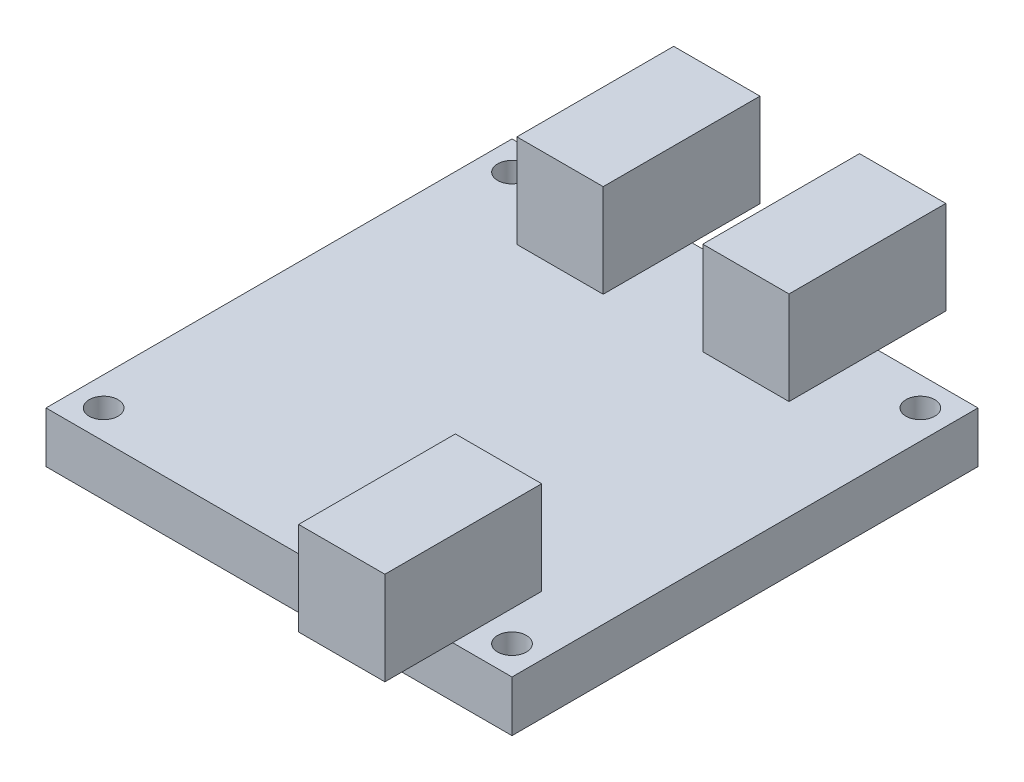
ISO-10303-21;
HEADER;
FILE_DESCRIPTION(('STEP AP214'),'2;1');
FILE_NAME('part.step','',(''),(''),'','','');
FILE_SCHEMA(('AUTOMOTIVE_DESIGN { 1 0 10303 214 1 1 1 1 }'));
ENDSEC;
DATA;
#1=APPLICATION_CONTEXT('core data for automotive mechanical design processes');
#2=APPLICATION_PROTOCOL_DEFINITION('international standard','automotive_design',2000,#1);
#3=PRODUCT_CONTEXT('',#1,'mechanical');
#4=PRODUCT('Part','Part','',(#3));
#5=PRODUCT_RELATED_PRODUCT_CATEGORY('part','',(#4));
#6=PRODUCT_DEFINITION_FORMATION('','',#4);
#7=PRODUCT_DEFINITION_CONTEXT('part definition',#1,'design');
#8=PRODUCT_DEFINITION('design','',#6,#7);
#9=PRODUCT_DEFINITION_SHAPE('','',#8);
#10=(LENGTH_UNIT() NAMED_UNIT(*) SI_UNIT(.MILLI.,.METRE.));
#11=(NAMED_UNIT(*) PLANE_ANGLE_UNIT() SI_UNIT($,.RADIAN.));
#12=(NAMED_UNIT(*) SI_UNIT($,.STERADIAN.) SOLID_ANGLE_UNIT());
#13=UNCERTAINTY_MEASURE_WITH_UNIT(LENGTH_MEASURE(1.E-05),#10,'distance_accuracy_value','');
#14=(GEOMETRIC_REPRESENTATION_CONTEXT(3) GLOBAL_UNCERTAINTY_ASSIGNED_CONTEXT((#13)) GLOBAL_UNIT_ASSIGNED_CONTEXT((#10,
#11,#12)) REPRESENTATION_CONTEXT('',''));
#15=CARTESIAN_POINT('',(0.,0.,0.));
#16=DIRECTION('',(0.,0.,1.));
#17=DIRECTION('',(1.,0.,0.));
#18=AXIS2_PLACEMENT_3D('',#15,#16,#17);
#19=CARTESIAN_POINT('',(0.,6.,0.));
#20=DIRECTION('',(0.,-1.,0.));
#21=DIRECTION('',(0.,0.,-1.));
#22=AXIS2_PLACEMENT_3D('',#19,#20,#21);
#23=PLANE('',#22);
#24=CARTESIAN_POINT('',(-24.095,6.,24.095));
#25=DIRECTION('',(0.,1.,0.));
#26=DIRECTION('',(0.,0.,1.));
#27=AXIS2_PLACEMENT_3D('',#24,#25,#26);
#28=CIRCLE('',#27,1.69999999999999);
#29=CARTESIAN_POINT('',(-24.095,6.,25.795));
#30=VERTEX_POINT('',#29);
#31=EDGE_CURVE('E321',#30,#30,#28,.T.);
#32=ORIENTED_EDGE('',*,*,#31,.F.);
#33=EDGE_LOOP('',(#32));
#34=FACE_BOUND('',#33,.T.);
#35=CARTESIAN_POINT('',(24.095,6.,24.095));
#36=DIRECTION('',(0.,1.,0.));
#37=DIRECTION('',(0.,0.,1.));
#38=AXIS2_PLACEMENT_3D('',#35,#36,#37);
#39=CIRCLE('',#38,1.69999999999999);
#40=CARTESIAN_POINT('',(24.095,6.,25.795));
#41=VERTEX_POINT('',#40);
#42=EDGE_CURVE('E313',#41,#41,#39,.T.);
#43=ORIENTED_EDGE('',*,*,#42,.F.);
#44=EDGE_LOOP('',(#43));
#45=FACE_BOUND('',#44,.T.);
#46=CARTESIAN_POINT('',(24.095,6.,-24.095));
#47=DIRECTION('',(0.,1.,0.));
#48=DIRECTION('',(0.,0.,1.));
#49=AXIS2_PLACEMENT_3D('',#46,#47,#48);
#50=CIRCLE('',#49,1.69999999999999);
#51=CARTESIAN_POINT('',(24.095,6.,-22.395));
#52=VERTEX_POINT('',#51);
#53=EDGE_CURVE('E305',#52,#52,#50,.T.);
#54=ORIENTED_EDGE('',*,*,#53,.F.);
#55=EDGE_LOOP('',(#54));
#56=FACE_BOUND('',#55,.T.);
#57=CARTESIAN_POINT('',(-24.095,6.,-24.095));
#58=DIRECTION('',(0.,1.,0.));
#59=DIRECTION('',(0.,0.,1.));
#60=AXIS2_PLACEMENT_3D('',#57,#58,#59);
#61=CIRCLE('',#60,1.69999999999999);
#62=CARTESIAN_POINT('',(-24.095,6.,-22.395));
#63=VERTEX_POINT('',#62);
#64=EDGE_CURVE('E297',#63,#63,#61,.T.);
#65=ORIENTED_EDGE('',*,*,#64,.F.);
#66=EDGE_LOOP('',(#65));
#67=FACE_BOUND('',#66,.T.);
#68=DIRECTION('',(0.,0.,1.));
#69=VECTOR('',#68,1.);
#70=CARTESIAN_POINT('',(10.315,6.,16.995));
#71=LINE('',#70,#69);
#72=CARTESIAN_POINT('',(10.315,6.,16.995));
#73=VERTEX_POINT('',#72);
#74=CARTESIAN_POINT('',(10.315,6.,27.495));
#75=VERTEX_POINT('',#74);
#76=EDGE_CURVE('E57',#73,#75,#71,.T.);
#77=ORIENTED_EDGE('',*,*,#76,.F.);
#78=DIRECTION('',(-1.,0.,0.));
#79=VECTOR('',#78,1.);
#80=CARTESIAN_POINT('',(10.315,6.,16.995));
#81=LINE('',#80,#79);
#82=CARTESIAN_POINT('',(20.495,6.,16.995));
#83=VERTEX_POINT('',#82);
#84=EDGE_CURVE('E61',#83,#73,#81,.T.);
#85=ORIENTED_EDGE('',*,*,#84,.F.);
#86=DIRECTION('',(0.,0.,-1.));
#87=VECTOR('',#86,1.);
#88=CARTESIAN_POINT('',(20.495,6.,16.995));
#89=LINE('',#88,#87);
#90=CARTESIAN_POINT('',(20.495,6.,27.495));
#91=VERTEX_POINT('',#90);
#92=EDGE_CURVE('E404',#91,#83,#89,.T.);
#93=ORIENTED_EDGE('',*,*,#92,.F.);
#94=DIRECTION('',(1.,0.,0.));
#95=VECTOR('',#94,1.);
#96=CARTESIAN_POINT('',(-27.495,6.,27.495));
#97=LINE('',#96,#95);
#98=CARTESIAN_POINT('',(27.495,6.,27.495));
#99=VERTEX_POINT('',#98);
#100=EDGE_CURVE('E346',#91,#99,#97,.T.);
#101=ORIENTED_EDGE('',*,*,#100,.T.);
#102=DIRECTION('',(0.,0.,-1.));
#103=VECTOR('',#102,1.);
#104=CARTESIAN_POINT('',(27.495,6.,27.495));
#105=LINE('',#104,#103);
#106=CARTESIAN_POINT('',(27.495,6.,-27.495));
#107=VERTEX_POINT('',#106);
#108=EDGE_CURVE('E330',#99,#107,#105,.T.);
#109=ORIENTED_EDGE('',*,*,#108,.T.);
#110=DIRECTION('',(-1.,0.,0.));
#111=VECTOR('',#110,1.);
#112=CARTESIAN_POINT('',(-27.495,6.,-27.495));
#113=LINE('',#112,#111);
#114=CARTESIAN_POINT('',(15.695,6.,-27.495));
#115=VERTEX_POINT('',#114);
#116=EDGE_CURVE('E336',#107,#115,#113,.T.);
#117=ORIENTED_EDGE('',*,*,#116,.T.);
#118=DIRECTION('',(0.,0.,-1.));
#119=VECTOR('',#118,1.);
#120=CARTESIAN_POINT('',(15.695,6.,-35.495));
#121=LINE('',#120,#119);
#122=CARTESIAN_POINT('',(15.695,6.,-16.995));
#123=VERTEX_POINT('',#122);
#124=EDGE_CURVE('E233',#123,#115,#121,.T.);
#125=ORIENTED_EDGE('',*,*,#124,.F.);
#126=DIRECTION('',(1.,0.,0.));
#127=VECTOR('',#126,1.);
#128=CARTESIAN_POINT('',(5.515,6.,-16.995));
#129=LINE('',#128,#127);
#130=CARTESIAN_POINT('',(5.515,6.,-16.995));
#131=VERTEX_POINT('',#130);
#132=EDGE_CURVE('E228',#131,#123,#129,.T.);
#133=ORIENTED_EDGE('',*,*,#132,.F.);
#134=DIRECTION('',(0.,0.,1.));
#135=VECTOR('',#134,1.);
#136=CARTESIAN_POINT('',(5.515,6.,-35.495));
#137=LINE('',#136,#135);
#138=CARTESIAN_POINT('',(5.515,6.,-27.495));
#139=VERTEX_POINT('',#138);
#140=EDGE_CURVE('E200',#139,#131,#137,.T.);
#141=ORIENTED_EDGE('',*,*,#140,.F.);
#142=CARTESIAN_POINT('',(-6.23500000000001,6.,-27.495));
#143=VERTEX_POINT('',#142);
#144=EDGE_CURVE('E342',#139,#143,#113,.T.);
#145=ORIENTED_EDGE('',*,*,#144,.T.);
#146=DIRECTION('',(0.,0.,-1.));
#147=VECTOR('',#146,1.);
#148=CARTESIAN_POINT('',(-6.235,6.,-35.495));
#149=LINE('',#148,#147);
#150=CARTESIAN_POINT('',(-6.235,6.,-16.995));
#151=VERTEX_POINT('',#150);
#152=EDGE_CURVE('E276',#151,#143,#149,.T.);
#153=ORIENTED_EDGE('',*,*,#152,.F.);
#154=DIRECTION('',(1.,0.,0.));
#155=VECTOR('',#154,1.);
#156=CARTESIAN_POINT('',(-16.415,6.,-16.995));
#157=LINE('',#156,#155);
#158=CARTESIAN_POINT('',(-16.415,6.,-16.995));
#159=VERTEX_POINT('',#158);
#160=EDGE_CURVE('E271',#159,#151,#157,.T.);
#161=ORIENTED_EDGE('',*,*,#160,.F.);
#162=DIRECTION('',(0.,0.,1.));
#163=VECTOR('',#162,1.);
#164=CARTESIAN_POINT('',(-16.415,6.,-35.495));
#165=LINE('',#164,#163);
#166=CARTESIAN_POINT('',(-16.415,6.,-27.495));
#167=VERTEX_POINT('',#166);
#168=EDGE_CURVE('E11',#167,#159,#165,.T.);
#169=ORIENTED_EDGE('',*,*,#168,.F.);
#170=CARTESIAN_POINT('',(-27.495,6.,-27.495));
#171=VERTEX_POINT('',#170);
#172=EDGE_CURVE('E334',#167,#171,#113,.T.);
#173=ORIENTED_EDGE('',*,*,#172,.T.);
#174=DIRECTION('',(0.,0.,1.));
#175=VECTOR('',#174,1.);
#176=CARTESIAN_POINT('',(-27.495,6.,27.495));
#177=LINE('',#176,#175);
#178=CARTESIAN_POINT('',(-27.495,6.,27.495));
#179=VERTEX_POINT('',#178);
#180=EDGE_CURVE('E340',#171,#179,#177,.T.);
#181=ORIENTED_EDGE('',*,*,#180,.T.);
#182=EDGE_CURVE('E347',#179,#75,#97,.T.);
#183=ORIENTED_EDGE('',*,*,#182,.T.);
#184=EDGE_LOOP('',(#77,#85,#93,#101,#109,#117,#125,#133,#141,#145,#153,#161,#169,#173,#181,#183));
#185=FACE_BOUND('',#184,.T.);
#186=ADVANCED_FACE('F39',(#34,#45,#56,#67,#185),#23,.F.);
#187=CARTESIAN_POINT('',(27.495,6.,27.495));
#188=DIRECTION('',(-1.,0.,0.));
#189=DIRECTION('',(0.,0.,1.));
#190=AXIS2_PLACEMENT_3D('',#187,#188,#189);
#191=PLANE('',#190);
#192=DIRECTION('',(0.,0.,-1.));
#193=VECTOR('',#192,1.);
#194=CARTESIAN_POINT('',(27.495,0.,27.495));
#195=LINE('',#194,#193);
#196=CARTESIAN_POINT('',(27.495,0.,27.495));
#197=VERTEX_POINT('',#196);
#198=CARTESIAN_POINT('',(27.495,0.,-27.495));
#199=VERTEX_POINT('',#198);
#200=EDGE_CURVE('E329',#197,#199,#195,.T.);
#201=ORIENTED_EDGE('',*,*,#200,.T.);
#202=DIRECTION('',(0.,-1.,0.));
#203=VECTOR('',#202,1.);
#204=CARTESIAN_POINT('',(27.495,6.,-27.495));
#205=LINE('',#204,#203);
#206=EDGE_CURVE('E43',#107,#199,#205,.T.);
#207=ORIENTED_EDGE('',*,*,#206,.F.);
#208=ORIENTED_EDGE('',*,*,#108,.F.);
#209=DIRECTION('',(0.,-1.,0.));
#210=VECTOR('',#209,1.);
#211=CARTESIAN_POINT('',(27.495,6.,27.495));
#212=LINE('',#211,#210);
#213=EDGE_CURVE('E350',#99,#197,#212,.T.);
#214=ORIENTED_EDGE('',*,*,#213,.T.);
#215=EDGE_LOOP('',(#201,#207,#208,#214));
#216=FACE_BOUND('',#215,.T.);
#217=ADVANCED_FACE('F41',(#216),#191,.F.);
#218=CARTESIAN_POINT('',(-27.495,6.,-27.495));
#219=DIRECTION('',(0.,0.,1.));
#220=DIRECTION('',(1.,0.,0.));
#221=AXIS2_PLACEMENT_3D('',#218,#219,#220);
#222=PLANE('',#221);
#223=DIRECTION('',(-1.,0.,0.));
#224=VECTOR('',#223,1.);
#225=CARTESIAN_POINT('',(-27.495,0.,-27.495));
#226=LINE('',#225,#224);
#227=CARTESIAN_POINT('',(-27.495,0.,-27.495));
#228=VERTEX_POINT('',#227);
#229=EDGE_CURVE('E355',#199,#228,#226,.T.);
#230=ORIENTED_EDGE('',*,*,#229,.T.);
#231=DIRECTION('',(0.,-1.,0.));
#232=VECTOR('',#231,1.);
#233=CARTESIAN_POINT('',(-27.495,6.,-27.495));
#234=LINE('',#233,#232);
#235=EDGE_CURVE('E369',#171,#228,#234,.T.);
#236=ORIENTED_EDGE('',*,*,#235,.F.);
#237=ORIENTED_EDGE('',*,*,#172,.F.);
#238=EDGE_CURVE('E343',#143,#167,#113,.T.);
#239=ORIENTED_EDGE('',*,*,#238,.F.);
#240=ORIENTED_EDGE('',*,*,#144,.F.);
#241=EDGE_CURVE('E341',#115,#139,#113,.T.);
#242=ORIENTED_EDGE('',*,*,#241,.F.);
#243=ORIENTED_EDGE('',*,*,#116,.F.);
#244=ORIENTED_EDGE('',*,*,#206,.T.);
#245=EDGE_LOOP('',(#230,#236,#237,#239,#240,#242,#243,#244));
#246=FACE_BOUND('',#245,.T.);
#247=ADVANCED_FACE('F380',(#246),#222,.F.);
#248=CARTESIAN_POINT('',(-27.495,6.,27.495));
#249=DIRECTION('',(1.,0.,0.));
#250=DIRECTION('',(0.,0.,-1.));
#251=AXIS2_PLACEMENT_3D('',#248,#249,#250);
#252=PLANE('',#251);
#253=DIRECTION('',(0.,0.,1.));
#254=VECTOR('',#253,1.);
#255=CARTESIAN_POINT('',(-27.495,0.,27.495));
#256=LINE('',#255,#254);
#257=CARTESIAN_POINT('',(-27.495,0.,27.495));
#258=VERTEX_POINT('',#257);
#259=EDGE_CURVE('E358',#228,#258,#256,.T.);
#260=ORIENTED_EDGE('',*,*,#259,.T.);
#261=DIRECTION('',(0.,-1.,0.));
#262=VECTOR('',#261,1.);
#263=CARTESIAN_POINT('',(-27.495,6.,27.495));
#264=LINE('',#263,#262);
#265=EDGE_CURVE('E366',#179,#258,#264,.T.);
#266=ORIENTED_EDGE('',*,*,#265,.F.);
#267=ORIENTED_EDGE('',*,*,#180,.F.);
#268=ORIENTED_EDGE('',*,*,#235,.T.);
#269=EDGE_LOOP('',(#260,#266,#267,#268));
#270=FACE_BOUND('',#269,.T.);
#271=ADVANCED_FACE('F389',(#270),#252,.F.);
#272=CARTESIAN_POINT('',(-27.495,6.,27.495));
#273=DIRECTION('',(0.,0.,-1.));
#274=DIRECTION('',(-1.,0.,0.));
#275=AXIS2_PLACEMENT_3D('',#272,#273,#274);
#276=PLANE('',#275);
#277=DIRECTION('',(1.,0.,0.));
#278=VECTOR('',#277,1.);
#279=CARTESIAN_POINT('',(-27.495,0.,27.495));
#280=LINE('',#279,#278);
#281=EDGE_CURVE('E335',#258,#197,#280,.T.);
#282=ORIENTED_EDGE('',*,*,#281,.T.);
#283=ORIENTED_EDGE('',*,*,#213,.F.);
#284=ORIENTED_EDGE('',*,*,#100,.F.);
#285=EDGE_CURVE('E351',#75,#91,#97,.T.);
#286=ORIENTED_EDGE('',*,*,#285,.F.);
#287=ORIENTED_EDGE('',*,*,#182,.F.);
#288=ORIENTED_EDGE('',*,*,#265,.T.);
#289=EDGE_LOOP('',(#282,#283,#284,#286,#287,#288));
#290=FACE_BOUND('',#289,.T.);
#291=ADVANCED_FACE('F392',(#290),#276,.F.);
#292=CARTESIAN_POINT('',(0.,0.,0.));
#293=DIRECTION('',(0.,-1.,0.));
#294=DIRECTION('',(0.,0.,-1.));
#295=AXIS2_PLACEMENT_3D('',#292,#293,#294);
#296=PLANE('',#295);
#297=CARTESIAN_POINT('',(-24.095,0.,-24.095));
#298=DIRECTION('',(0.,1.,0.));
#299=DIRECTION('',(0.,0.,1.));
#300=AXIS2_PLACEMENT_3D('',#297,#298,#299);
#301=CIRCLE('',#300,1.7);
#302=CARTESIAN_POINT('',(-24.095,0.,-22.395));
#303=VERTEX_POINT('',#302);
#304=EDGE_CURVE('E301',#303,#303,#301,.T.);
#305=ORIENTED_EDGE('',*,*,#304,.T.);
#306=EDGE_LOOP('',(#305));
#307=FACE_BOUND('',#306,.T.);
#308=CARTESIAN_POINT('',(24.095,0.,-24.095));
#309=DIRECTION('',(0.,1.,0.));
#310=DIRECTION('',(0.,0.,1.));
#311=AXIS2_PLACEMENT_3D('',#308,#309,#310);
#312=CIRCLE('',#311,1.7);
#313=CARTESIAN_POINT('',(24.095,0.,-22.395));
#314=VERTEX_POINT('',#313);
#315=EDGE_CURVE('E309',#314,#314,#312,.T.);
#316=ORIENTED_EDGE('',*,*,#315,.T.);
#317=EDGE_LOOP('',(#316));
#318=FACE_BOUND('',#317,.T.);
#319=CARTESIAN_POINT('',(24.095,0.,24.095));
#320=DIRECTION('',(0.,1.,0.));
#321=DIRECTION('',(0.,0.,1.));
#322=AXIS2_PLACEMENT_3D('',#319,#320,#321);
#323=CIRCLE('',#322,1.7);
#324=CARTESIAN_POINT('',(24.095,0.,25.795));
#325=VERTEX_POINT('',#324);
#326=EDGE_CURVE('E317',#325,#325,#323,.T.);
#327=ORIENTED_EDGE('',*,*,#326,.T.);
#328=EDGE_LOOP('',(#327));
#329=FACE_BOUND('',#328,.T.);
#330=CARTESIAN_POINT('',(-24.095,0.,24.095));
#331=DIRECTION('',(0.,1.,0.));
#332=DIRECTION('',(0.,0.,1.));
#333=AXIS2_PLACEMENT_3D('',#330,#331,#332);
#334=CIRCLE('',#333,1.7);
#335=CARTESIAN_POINT('',(-24.095,0.,25.795));
#336=VERTEX_POINT('',#335);
#337=EDGE_CURVE('E325',#336,#336,#334,.T.);
#338=ORIENTED_EDGE('',*,*,#337,.T.);
#339=EDGE_LOOP('',(#338));
#340=FACE_BOUND('',#339,.T.);
#341=ORIENTED_EDGE('',*,*,#200,.F.);
#342=ORIENTED_EDGE('',*,*,#281,.F.);
#343=ORIENTED_EDGE('',*,*,#259,.F.);
#344=ORIENTED_EDGE('',*,*,#229,.F.);
#345=EDGE_LOOP('',(#341,#342,#343,#344));
#346=FACE_BOUND('',#345,.T.);
#347=ADVANCED_FACE('F387',(#307,#318,#329,#340,#346),#296,.T.);
#348=CARTESIAN_POINT('',(-24.095,6.,24.095));
#349=DIRECTION('',(0.,1.,0.));
#350=DIRECTION('',(0.,0.,1.));
#351=AXIS2_PLACEMENT_3D('',#348,#349,#350);
#352=CYLINDRICAL_SURFACE('',#351,1.69999999999999);
#353=ORIENTED_EDGE('',*,*,#337,.F.);
#354=EDGE_LOOP('',(#353));
#355=FACE_BOUND('',#354,.T.);
#356=ORIENTED_EDGE('',*,*,#31,.T.);
#357=EDGE_LOOP('',(#356));
#358=FACE_BOUND('',#357,.T.);
#359=ADVANCED_FACE('F504',(#355,#358),#352,.F.);
#360=CARTESIAN_POINT('',(24.095,6.,24.095));
#361=DIRECTION('',(0.,1.,0.));
#362=DIRECTION('',(0.,0.,1.));
#363=AXIS2_PLACEMENT_3D('',#360,#361,#362);
#364=CYLINDRICAL_SURFACE('',#363,1.69999999999999);
#365=ORIENTED_EDGE('',*,*,#326,.F.);
#366=EDGE_LOOP('',(#365));
#367=FACE_BOUND('',#366,.T.);
#368=ORIENTED_EDGE('',*,*,#42,.T.);
#369=EDGE_LOOP('',(#368));
#370=FACE_BOUND('',#369,.T.);
#371=ADVANCED_FACE('F662',(#367,#370),#364,.F.);
#372=CARTESIAN_POINT('',(24.095,6.,-24.095));
#373=DIRECTION('',(0.,1.,0.));
#374=DIRECTION('',(0.,0.,1.));
#375=AXIS2_PLACEMENT_3D('',#372,#373,#374);
#376=CYLINDRICAL_SURFACE('',#375,1.69999999999999);
#377=ORIENTED_EDGE('',*,*,#315,.F.);
#378=EDGE_LOOP('',(#377));
#379=FACE_BOUND('',#378,.T.);
#380=ORIENTED_EDGE('',*,*,#53,.T.);
#381=EDGE_LOOP('',(#380));
#382=FACE_BOUND('',#381,.T.);
#383=ADVANCED_FACE('F659',(#379,#382),#376,.F.);
#384=CARTESIAN_POINT('',(-24.095,6.,-24.095));
#385=DIRECTION('',(0.,1.,0.));
#386=DIRECTION('',(0.,0.,1.));
#387=AXIS2_PLACEMENT_3D('',#384,#385,#386);
#388=CYLINDRICAL_SURFACE('',#387,1.69999999999999);
#389=ORIENTED_EDGE('',*,*,#304,.F.);
#390=EDGE_LOOP('',(#389));
#391=FACE_BOUND('',#390,.T.);
#392=ORIENTED_EDGE('',*,*,#64,.T.);
#393=EDGE_LOOP('',(#392));
#394=FACE_BOUND('',#393,.T.);
#395=ADVANCED_FACE('F525',(#391,#394),#388,.F.);
#396=CARTESIAN_POINT('',(0.,6.,0.));
#397=DIRECTION('',(0.,1.,0.));
#398=DIRECTION('',(0.,0.,1.));
#399=AXIS2_PLACEMENT_3D('',#396,#397,#398);
#400=PLANE('',#399);
#401=CARTESIAN_POINT('',(-6.235,6.,-35.495));
#402=VERTEX_POINT('',#401);
#403=EDGE_CURVE('E275',#143,#402,#149,.T.);
#404=ORIENTED_EDGE('',*,*,#403,.F.);
#405=ORIENTED_EDGE('',*,*,#238,.T.);
#406=CARTESIAN_POINT('',(-16.415,6.,-35.495));
#407=VERTEX_POINT('',#406);
#408=EDGE_CURVE('E50',#407,#167,#165,.T.);
#409=ORIENTED_EDGE('',*,*,#408,.F.);
#410=DIRECTION('',(-1.,0.,0.));
#411=VECTOR('',#410,1.);
#412=CARTESIAN_POINT('',(-16.415,6.,-35.495));
#413=LINE('',#412,#411);
#414=EDGE_CURVE('E259',#402,#407,#413,.T.);
#415=ORIENTED_EDGE('',*,*,#414,.F.);
#416=EDGE_LOOP('',(#404,#405,#409,#415));
#417=FACE_BOUND('',#416,.T.);
#418=ADVANCED_FACE('F464',(#417),#400,.F.);
#419=CARTESIAN_POINT('',(-16.415,17.,-35.495));
#420=DIRECTION('',(1.,0.,0.));
#421=DIRECTION('',(0.,0.,-1.));
#422=AXIS2_PLACEMENT_3D('',#419,#420,#421);
#423=PLANE('',#422);
#424=ORIENTED_EDGE('',*,*,#408,.T.);
#425=ORIENTED_EDGE('',*,*,#168,.T.);
#426=DIRECTION('',(0.,-1.,0.));
#427=VECTOR('',#426,1.);
#428=CARTESIAN_POINT('',(-16.415,17.,-16.995));
#429=LINE('',#428,#427);
#430=CARTESIAN_POINT('',(-16.415,17.,-16.995));
#431=VERTEX_POINT('',#430);
#432=EDGE_CURVE('E293',#431,#159,#429,.T.);
#433=ORIENTED_EDGE('',*,*,#432,.F.);
#434=DIRECTION('',(0.,0.,1.));
#435=VECTOR('',#434,1.);
#436=CARTESIAN_POINT('',(-16.415,17.,-35.495));
#437=LINE('',#436,#435);
#438=CARTESIAN_POINT('',(-16.415,17.,-35.495));
#439=VERTEX_POINT('',#438);
#440=EDGE_CURVE('E254',#439,#431,#437,.T.);
#441=ORIENTED_EDGE('',*,*,#440,.F.);
#442=DIRECTION('',(0.,-1.,0.));
#443=VECTOR('',#442,1.);
#444=CARTESIAN_POINT('',(-16.415,17.,-35.495));
#445=LINE('',#444,#443);
#446=EDGE_CURVE('E267',#439,#407,#445,.T.);
#447=ORIENTED_EDGE('',*,*,#446,.T.);
#448=EDGE_LOOP('',(#424,#425,#433,#441,#447));
#449=FACE_BOUND('',#448,.T.);
#450=ADVANCED_FACE('F474',(#449),#423,.F.);
#451=CARTESIAN_POINT('',(-16.415,17.,-16.995));
#452=DIRECTION('',(0.,0.,-1.));
#453=DIRECTION('',(-1.,0.,0.));
#454=AXIS2_PLACEMENT_3D('',#451,#452,#453);
#455=PLANE('',#454);
#456=ORIENTED_EDGE('',*,*,#160,.T.);
#457=DIRECTION('',(0.,-1.,0.));
#458=VECTOR('',#457,1.);
#459=CARTESIAN_POINT('',(-6.235,17.,-16.995));
#460=LINE('',#459,#458);
#461=CARTESIAN_POINT('',(-6.235,17.,-16.995));
#462=VERTEX_POINT('',#461);
#463=EDGE_CURVE('E289',#462,#151,#460,.T.);
#464=ORIENTED_EDGE('',*,*,#463,.F.);
#465=DIRECTION('',(1.,0.,0.));
#466=VECTOR('',#465,1.);
#467=CARTESIAN_POINT('',(-16.415,17.,-16.995));
#468=LINE('',#467,#466);
#469=EDGE_CURVE('E258',#431,#462,#468,.T.);
#470=ORIENTED_EDGE('',*,*,#469,.F.);
#471=ORIENTED_EDGE('',*,*,#432,.T.);
#472=EDGE_LOOP('',(#456,#464,#470,#471));
#473=FACE_BOUND('',#472,.T.);
#474=ADVANCED_FACE('F471',(#473),#455,.F.);
#475=CARTESIAN_POINT('',(-6.235,17.,-35.495));
#476=DIRECTION('',(-1.,0.,0.));
#477=DIRECTION('',(0.,0.,1.));
#478=AXIS2_PLACEMENT_3D('',#475,#476,#477);
#479=PLANE('',#478);
#480=ORIENTED_EDGE('',*,*,#152,.T.);
#481=ORIENTED_EDGE('',*,*,#403,.T.);
#482=DIRECTION('',(0.,-1.,0.));
#483=VECTOR('',#482,1.);
#484=CARTESIAN_POINT('',(-6.235,17.,-35.495));
#485=LINE('',#484,#483);
#486=CARTESIAN_POINT('',(-6.235,17.,-35.495));
#487=VERTEX_POINT('',#486);
#488=EDGE_CURVE('E285',#487,#402,#485,.T.);
#489=ORIENTED_EDGE('',*,*,#488,.F.);
#490=DIRECTION('',(0.,0.,-1.));
#491=VECTOR('',#490,1.);
#492=CARTESIAN_POINT('',(-6.235,17.,-35.495));
#493=LINE('',#492,#491);
#494=EDGE_CURVE('E262',#462,#487,#493,.T.);
#495=ORIENTED_EDGE('',*,*,#494,.F.);
#496=ORIENTED_EDGE('',*,*,#463,.T.);
#497=EDGE_LOOP('',(#480,#481,#489,#495,#496));
#498=FACE_BOUND('',#497,.T.);
#499=ADVANCED_FACE('F467',(#498),#479,.F.);
#500=CARTESIAN_POINT('',(-16.415,17.,-35.495));
#501=DIRECTION('',(0.,0.,1.));
#502=DIRECTION('',(1.,0.,0.));
#503=AXIS2_PLACEMENT_3D('',#500,#501,#502);
#504=PLANE('',#503);
#505=ORIENTED_EDGE('',*,*,#414,.T.);
#506=ORIENTED_EDGE('',*,*,#446,.F.);
#507=DIRECTION('',(-1.,0.,0.));
#508=VECTOR('',#507,1.);
#509=CARTESIAN_POINT('',(-16.415,17.,-35.495));
#510=LINE('',#509,#508);
#511=EDGE_CURVE('E265',#487,#439,#510,.T.);
#512=ORIENTED_EDGE('',*,*,#511,.F.);
#513=ORIENTED_EDGE('',*,*,#488,.T.);
#514=EDGE_LOOP('',(#505,#506,#512,#513));
#515=FACE_BOUND('',#514,.T.);
#516=ADVANCED_FACE('F479',(#515),#504,.F.);
#517=CARTESIAN_POINT('',(0.,17.,0.));
#518=DIRECTION('',(0.,1.,0.));
#519=DIRECTION('',(0.,0.,1.));
#520=AXIS2_PLACEMENT_3D('',#517,#518,#519);
#521=PLANE('',#520);
#522=ORIENTED_EDGE('',*,*,#440,.T.);
#523=ORIENTED_EDGE('',*,*,#469,.T.);
#524=ORIENTED_EDGE('',*,*,#494,.T.);
#525=ORIENTED_EDGE('',*,*,#511,.T.);
#526=EDGE_LOOP('',(#522,#523,#524,#525));
#527=FACE_BOUND('',#526,.T.);
#528=ADVANCED_FACE('F481',(#527),#521,.T.);
#529=CARTESIAN_POINT('',(0.,6.,0.));
#530=DIRECTION('',(0.,1.,0.));
#531=DIRECTION('',(0.,0.,1.));
#532=AXIS2_PLACEMENT_3D('',#529,#530,#531);
#533=PLANE('',#532);
#534=CARTESIAN_POINT('',(15.695,6.,-35.495));
#535=VERTEX_POINT('',#534);
#536=EDGE_CURVE('E232',#115,#535,#121,.T.);
#537=ORIENTED_EDGE('',*,*,#536,.F.);
#538=ORIENTED_EDGE('',*,*,#241,.T.);
#539=CARTESIAN_POINT('',(5.515,6.,-35.495));
#540=VERTEX_POINT('',#539);
#541=EDGE_CURVE('E205',#540,#139,#137,.T.);
#542=ORIENTED_EDGE('',*,*,#541,.F.);
#543=DIRECTION('',(-1.,0.,0.));
#544=VECTOR('',#543,1.);
#545=CARTESIAN_POINT('',(5.515,6.,-35.495));
#546=LINE('',#545,#544);
#547=EDGE_CURVE('E216',#535,#540,#546,.T.);
#548=ORIENTED_EDGE('',*,*,#547,.F.);
#549=EDGE_LOOP('',(#537,#538,#542,#548));
#550=FACE_BOUND('',#549,.T.);
#551=ADVANCED_FACE('F447',(#550),#533,.F.);
#552=CARTESIAN_POINT('',(5.515,17.,-35.495));
#553=DIRECTION('',(1.,0.,0.));
#554=DIRECTION('',(0.,0.,-1.));
#555=AXIS2_PLACEMENT_3D('',#552,#553,#554);
#556=PLANE('',#555);
#557=ORIENTED_EDGE('',*,*,#541,.T.);
#558=ORIENTED_EDGE('',*,*,#140,.T.);
#559=DIRECTION('',(0.,-1.,0.));
#560=VECTOR('',#559,1.);
#561=CARTESIAN_POINT('',(5.515,17.,-16.995));
#562=LINE('',#561,#560);
#563=CARTESIAN_POINT('',(5.515,17.,-16.995));
#564=VERTEX_POINT('',#563);
#565=EDGE_CURVE('E250',#564,#131,#562,.T.);
#566=ORIENTED_EDGE('',*,*,#565,.F.);
#567=DIRECTION('',(0.,0.,1.));
#568=VECTOR('',#567,1.);
#569=CARTESIAN_POINT('',(5.515,17.,-35.495));
#570=LINE('',#569,#568);
#571=CARTESIAN_POINT('',(5.515,17.,-35.495));
#572=VERTEX_POINT('',#571);
#573=EDGE_CURVE('E211',#572,#564,#570,.T.);
#574=ORIENTED_EDGE('',*,*,#573,.F.);
#575=DIRECTION('',(0.,-1.,0.));
#576=VECTOR('',#575,1.);
#577=CARTESIAN_POINT('',(5.515,17.,-35.495));
#578=LINE('',#577,#576);
#579=EDGE_CURVE('E224',#572,#540,#578,.T.);
#580=ORIENTED_EDGE('',*,*,#579,.T.);
#581=EDGE_LOOP('',(#557,#558,#566,#574,#580));
#582=FACE_BOUND('',#581,.T.);
#583=ADVANCED_FACE('F449',(#582),#556,.F.);
#584=CARTESIAN_POINT('',(5.515,17.,-16.995));
#585=DIRECTION('',(0.,0.,-1.));
#586=DIRECTION('',(-1.,0.,0.));
#587=AXIS2_PLACEMENT_3D('',#584,#585,#586);
#588=PLANE('',#587);
#589=ORIENTED_EDGE('',*,*,#132,.T.);
#590=DIRECTION('',(0.,-1.,0.));
#591=VECTOR('',#590,1.);
#592=CARTESIAN_POINT('',(15.695,17.,-16.995));
#593=LINE('',#592,#591);
#594=CARTESIAN_POINT('',(15.695,17.,-16.995));
#595=VERTEX_POINT('',#594);
#596=EDGE_CURVE('E246',#595,#123,#593,.T.);
#597=ORIENTED_EDGE('',*,*,#596,.F.);
#598=DIRECTION('',(1.,0.,0.));
#599=VECTOR('',#598,1.);
#600=CARTESIAN_POINT('',(5.515,17.,-16.995));
#601=LINE('',#600,#599);
#602=EDGE_CURVE('E215',#564,#595,#601,.T.);
#603=ORIENTED_EDGE('',*,*,#602,.F.);
#604=ORIENTED_EDGE('',*,*,#565,.T.);
#605=EDGE_LOOP('',(#589,#597,#603,#604));
#606=FACE_BOUND('',#605,.T.);
#607=ADVANCED_FACE('F457',(#606),#588,.F.);
#608=CARTESIAN_POINT('',(15.695,17.,-35.495));
#609=DIRECTION('',(-1.,0.,0.));
#610=DIRECTION('',(0.,0.,1.));
#611=AXIS2_PLACEMENT_3D('',#608,#609,#610);
#612=PLANE('',#611);
#613=ORIENTED_EDGE('',*,*,#124,.T.);
#614=ORIENTED_EDGE('',*,*,#536,.T.);
#615=DIRECTION('',(0.,-1.,0.));
#616=VECTOR('',#615,1.);
#617=CARTESIAN_POINT('',(15.695,17.,-35.495));
#618=LINE('',#617,#616);
#619=CARTESIAN_POINT('',(15.695,17.,-35.495));
#620=VERTEX_POINT('',#619);
#621=EDGE_CURVE('E242',#620,#535,#618,.T.);
#622=ORIENTED_EDGE('',*,*,#621,.F.);
#623=DIRECTION('',(0.,0.,-1.));
#624=VECTOR('',#623,1.);
#625=CARTESIAN_POINT('',(15.695,17.,-35.495));
#626=LINE('',#625,#624);
#627=EDGE_CURVE('E219',#595,#620,#626,.T.);
#628=ORIENTED_EDGE('',*,*,#627,.F.);
#629=ORIENTED_EDGE('',*,*,#596,.T.);
#630=EDGE_LOOP('',(#613,#614,#622,#628,#629));
#631=FACE_BOUND('',#630,.T.);
#632=ADVANCED_FACE('F438',(#631),#612,.F.);
#633=CARTESIAN_POINT('',(5.515,17.,-35.495));
#634=DIRECTION('',(0.,0.,1.));
#635=DIRECTION('',(1.,0.,0.));
#636=AXIS2_PLACEMENT_3D('',#633,#634,#635);
#637=PLANE('',#636);
#638=ORIENTED_EDGE('',*,*,#547,.T.);
#639=ORIENTED_EDGE('',*,*,#579,.F.);
#640=DIRECTION('',(-1.,0.,0.));
#641=VECTOR('',#640,1.);
#642=CARTESIAN_POINT('',(5.515,17.,-35.495));
#643=LINE('',#642,#641);
#644=EDGE_CURVE('E222',#620,#572,#643,.T.);
#645=ORIENTED_EDGE('',*,*,#644,.F.);
#646=ORIENTED_EDGE('',*,*,#621,.T.);
#647=EDGE_LOOP('',(#638,#639,#645,#646));
#648=FACE_BOUND('',#647,.T.);
#649=ADVANCED_FACE('F444',(#648),#637,.F.);
#650=CARTESIAN_POINT('',(0.,17.,0.));
#651=DIRECTION('',(0.,1.,0.));
#652=DIRECTION('',(0.,0.,1.));
#653=AXIS2_PLACEMENT_3D('',#650,#651,#652);
#654=PLANE('',#653);
#655=ORIENTED_EDGE('',*,*,#573,.T.);
#656=ORIENTED_EDGE('',*,*,#602,.T.);
#657=ORIENTED_EDGE('',*,*,#627,.T.);
#658=ORIENTED_EDGE('',*,*,#644,.T.);
#659=EDGE_LOOP('',(#655,#656,#657,#658));
#660=FACE_BOUND('',#659,.T.);
#661=ADVANCED_FACE('F454',(#660),#654,.T.);
#662=CARTESIAN_POINT('',(0.,6.,0.));
#663=DIRECTION('',(0.,1.,0.));
#664=DIRECTION('',(0.,0.,1.));
#665=AXIS2_PLACEMENT_3D('',#662,#663,#664);
#666=PLANE('',#665);
#667=CARTESIAN_POINT('',(10.315,6.,35.495));
#668=VERTEX_POINT('',#667);
#669=EDGE_CURVE('E197',#75,#668,#71,.T.);
#670=ORIENTED_EDGE('',*,*,#669,.F.);
#671=ORIENTED_EDGE('',*,*,#285,.T.);
#672=CARTESIAN_POINT('',(20.495,6.,35.495));
#673=VERTEX_POINT('',#672);
#674=EDGE_CURVE('E409',#673,#91,#89,.T.);
#675=ORIENTED_EDGE('',*,*,#674,.F.);
#676=DIRECTION('',(1.,0.,0.));
#677=VECTOR('',#676,1.);
#678=CARTESIAN_POINT('',(10.315,6.,35.495));
#679=LINE('',#678,#677);
#680=EDGE_CURVE('E398',#668,#673,#679,.T.);
#681=ORIENTED_EDGE('',*,*,#680,.F.);
#682=EDGE_LOOP('',(#670,#671,#675,#681));
#683=FACE_BOUND('',#682,.T.);
#684=ADVANCED_FACE('F395',(#683),#666,.F.);
#685=CARTESIAN_POINT('',(10.315,17.,16.995));
#686=DIRECTION('',(1.,0.,0.));
#687=DIRECTION('',(0.,0.,-1.));
#688=AXIS2_PLACEMENT_3D('',#685,#686,#687);
#689=PLANE('',#688);
#690=ORIENTED_EDGE('',*,*,#76,.T.);
#691=ORIENTED_EDGE('',*,*,#669,.T.);
#692=DIRECTION('',(0.,-1.,0.));
#693=VECTOR('',#692,1.);
#694=CARTESIAN_POINT('',(10.315,17.,35.495));
#695=LINE('',#694,#693);
#696=CARTESIAN_POINT('',(10.315,17.,35.495));
#697=VERTEX_POINT('',#696);
#698=EDGE_CURVE('E177',#697,#668,#695,.T.);
#699=ORIENTED_EDGE('',*,*,#698,.F.);
#700=DIRECTION('',(0.,0.,1.));
#701=VECTOR('',#700,1.);
#702=CARTESIAN_POINT('',(10.315,17.,16.995));
#703=LINE('',#702,#701);
#704=CARTESIAN_POINT('',(10.315,17.,16.995));
#705=VERTEX_POINT('',#704);
#706=EDGE_CURVE('E184',#705,#697,#703,.T.);
#707=ORIENTED_EDGE('',*,*,#706,.F.);
#708=DIRECTION('',(0.,-1.,0.));
#709=VECTOR('',#708,1.);
#710=CARTESIAN_POINT('',(10.315,17.,16.995));
#711=LINE('',#710,#709);
#712=EDGE_CURVE('E401',#705,#73,#711,.T.);
#713=ORIENTED_EDGE('',*,*,#712,.T.);
#714=EDGE_LOOP('',(#690,#691,#699,#707,#713));
#715=FACE_BOUND('',#714,.T.);
#716=ADVANCED_FACE('F195',(#715),#689,.F.);
#717=CARTESIAN_POINT('',(10.315,17.,35.495));
#718=DIRECTION('',(0.,0.,-1.));
#719=DIRECTION('',(-1.,0.,0.));
#720=AXIS2_PLACEMENT_3D('',#717,#718,#719);
#721=PLANE('',#720);
#722=ORIENTED_EDGE('',*,*,#680,.T.);
#723=DIRECTION('',(0.,-1.,0.));
#724=VECTOR('',#723,1.);
#725=CARTESIAN_POINT('',(20.495,17.,35.495));
#726=LINE('',#725,#724);
#727=CARTESIAN_POINT('',(20.495,17.,35.495));
#728=VERTEX_POINT('',#727);
#729=EDGE_CURVE('E179',#728,#673,#726,.T.);
#730=ORIENTED_EDGE('',*,*,#729,.F.);
#731=DIRECTION('',(1.,0.,0.));
#732=VECTOR('',#731,1.);
#733=CARTESIAN_POINT('',(10.315,17.,35.495));
#734=LINE('',#733,#732);
#735=EDGE_CURVE('E173',#697,#728,#734,.T.);
#736=ORIENTED_EDGE('',*,*,#735,.F.);
#737=ORIENTED_EDGE('',*,*,#698,.T.);
#738=EDGE_LOOP('',(#722,#730,#736,#737));
#739=FACE_BOUND('',#738,.T.);
#740=ADVANCED_FACE('F175',(#739),#721,.F.);
#741=CARTESIAN_POINT('',(20.495,17.,16.995));
#742=DIRECTION('',(-1.,0.,0.));
#743=DIRECTION('',(0.,0.,1.));
#744=AXIS2_PLACEMENT_3D('',#741,#742,#743);
#745=PLANE('',#744);
#746=ORIENTED_EDGE('',*,*,#674,.T.);
#747=ORIENTED_EDGE('',*,*,#92,.T.);
#748=DIRECTION('',(0.,-1.,0.));
#749=VECTOR('',#748,1.);
#750=CARTESIAN_POINT('',(20.495,17.,16.995));
#751=LINE('',#750,#749);
#752=CARTESIAN_POINT('',(20.495,17.,16.995));
#753=VERTEX_POINT('',#752);
#754=EDGE_CURVE('E207',#753,#83,#751,.T.);
#755=ORIENTED_EDGE('',*,*,#754,.F.);
#756=DIRECTION('',(0.,0.,-1.));
#757=VECTOR('',#756,1.);
#758=CARTESIAN_POINT('',(20.495,17.,16.995));
#759=LINE('',#758,#757);
#760=EDGE_CURVE('E183',#728,#753,#759,.T.);
#761=ORIENTED_EDGE('',*,*,#760,.F.);
#762=ORIENTED_EDGE('',*,*,#729,.T.);
#763=EDGE_LOOP('',(#746,#747,#755,#761,#762));
#764=FACE_BOUND('',#763,.T.);
#765=ADVANCED_FACE('F421',(#764),#745,.F.);
#766=CARTESIAN_POINT('',(10.315,17.,16.995));
#767=DIRECTION('',(0.,0.,1.));
#768=DIRECTION('',(1.,0.,0.));
#769=AXIS2_PLACEMENT_3D('',#766,#767,#768);
#770=PLANE('',#769);
#771=ORIENTED_EDGE('',*,*,#84,.T.);
#772=ORIENTED_EDGE('',*,*,#712,.F.);
#773=DIRECTION('',(-1.,0.,0.));
#774=VECTOR('',#773,1.);
#775=CARTESIAN_POINT('',(10.315,17.,16.995));
#776=LINE('',#775,#774);
#777=EDGE_CURVE('E189',#753,#705,#776,.T.);
#778=ORIENTED_EDGE('',*,*,#777,.F.);
#779=ORIENTED_EDGE('',*,*,#754,.T.);
#780=EDGE_LOOP('',(#771,#772,#778,#779));
#781=FACE_BOUND('',#780,.T.);
#782=ADVANCED_FACE('F419',(#781),#770,.F.);
#783=CARTESIAN_POINT('',(0.,17.,0.));
#784=DIRECTION('',(0.,1.,0.));
#785=DIRECTION('',(0.,0.,1.));
#786=AXIS2_PLACEMENT_3D('',#783,#784,#785);
#787=PLANE('',#786);
#788=ORIENTED_EDGE('',*,*,#706,.T.);
#789=ORIENTED_EDGE('',*,*,#735,.T.);
#790=ORIENTED_EDGE('',*,*,#760,.T.);
#791=ORIENTED_EDGE('',*,*,#777,.T.);
#792=EDGE_LOOP('',(#788,#789,#790,#791));
#793=FACE_BOUND('',#792,.T.);
#794=ADVANCED_FACE('F187',(#793),#787,.T.);
#795=CLOSED_SHELL('',(#186,#217,#247,#271,#291,#347,#359,#371,#383,#395,#418,#450,#474,#499,
#516,#528,#551,#583,#607,#632,#649,#661,#684,#716,#740,#765,#782,#794));
#796=MANIFOLD_SOLID_BREP('B2',#795);
#797=ADVANCED_BREP_SHAPE_REPRESENTATION('',(#18,#796),#14);
#798=SHAPE_DEFINITION_REPRESENTATION(#9,#797);
ENDSEC;
END-ISO-10303-21;
